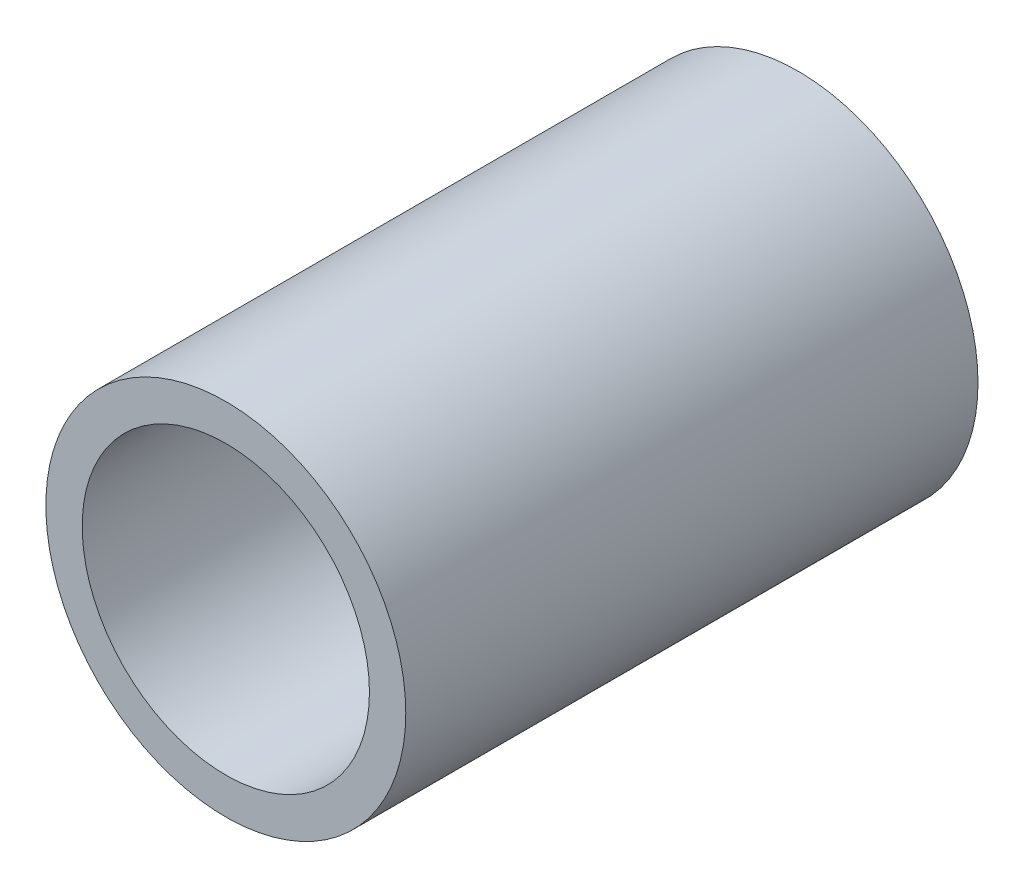
ISO-10303-21;
HEADER;
FILE_DESCRIPTION(('STEP AP214'),'2;1');
FILE_NAME('part.step','',(''),(''),'','','');
FILE_SCHEMA(('AUTOMOTIVE_DESIGN { 1 0 10303 214 1 1 1 1 }'));
ENDSEC;
DATA;
#1=APPLICATION_CONTEXT('core data for automotive mechanical design processes');
#2=APPLICATION_PROTOCOL_DEFINITION('international standard','automotive_design',2000,#1);
#3=PRODUCT_CONTEXT('',#1,'mechanical');
#4=PRODUCT('Part','Part','',(#3));
#5=PRODUCT_RELATED_PRODUCT_CATEGORY('part','',(#4));
#6=PRODUCT_DEFINITION_FORMATION('','',#4);
#7=PRODUCT_DEFINITION_CONTEXT('part definition',#1,'design');
#8=PRODUCT_DEFINITION('design','',#6,#7);
#9=PRODUCT_DEFINITION_SHAPE('','',#8);
#10=(LENGTH_UNIT() NAMED_UNIT(*) SI_UNIT(.MILLI.,.METRE.));
#11=(NAMED_UNIT(*) PLANE_ANGLE_UNIT() SI_UNIT($,.RADIAN.));
#12=(NAMED_UNIT(*) SI_UNIT($,.STERADIAN.) SOLID_ANGLE_UNIT());
#13=UNCERTAINTY_MEASURE_WITH_UNIT(LENGTH_MEASURE(1.E-05),#10,'distance_accuracy_value','');
#14=(GEOMETRIC_REPRESENTATION_CONTEXT(3) GLOBAL_UNCERTAINTY_ASSIGNED_CONTEXT((#13)) GLOBAL_UNIT_ASSIGNED_CONTEXT((#10,
#11,#12)) REPRESENTATION_CONTEXT('',''));
#15=CARTESIAN_POINT('',(0.,0.,0.));
#16=DIRECTION('',(0.,0.,1.));
#17=DIRECTION('',(1.,0.,0.));
#18=AXIS2_PLACEMENT_3D('',#15,#16,#17);
#19=CARTESIAN_POINT('',(0.,0.,6.35));
#20=DIRECTION('',(0.,0.,1.));
#21=DIRECTION('',(1.,0.,0.));
#22=AXIS2_PLACEMENT_3D('',#19,#20,#21);
#23=PLANE('',#22);
#24=CARTESIAN_POINT('',(0.,0.,6.35));
#25=DIRECTION('',(0.,0.,1.));
#26=DIRECTION('',(1.,0.,0.));
#27=AXIS2_PLACEMENT_3D('',#24,#25,#26);
#28=CIRCLE('',#27,3.99415);
#29=CARTESIAN_POINT('',(3.99415,0.,6.35));
#30=VERTEX_POINT('',#29);
#31=EDGE_CURVE('E10',#30,#30,#28,.T.);
#32=ORIENTED_EDGE('',*,*,#31,.T.);
#33=EDGE_LOOP('',(#32));
#34=FACE_BOUND('',#33,.T.);
#35=CARTESIAN_POINT('',(0.,0.,6.35));
#36=DIRECTION('',(0.,0.,1.));
#37=DIRECTION('',(1.,0.,0.));
#38=AXIS2_PLACEMENT_3D('',#35,#36,#37);
#39=CIRCLE('',#38,3.1877);
#40=CARTESIAN_POINT('',(3.1877,0.,6.35));
#41=VERTEX_POINT('',#40);
#42=EDGE_CURVE('E42',#41,#41,#39,.T.);
#43=ORIENTED_EDGE('',*,*,#42,.F.);
#44=EDGE_LOOP('',(#43));
#45=FACE_BOUND('',#44,.T.);
#46=ADVANCED_FACE('F35',(#34,#45),#23,.T.);
#47=CARTESIAN_POINT('',(0.,0.,6.35));
#48=DIRECTION('',(0.,0.,-1.));
#49=DIRECTION('',(-1.,0.,0.));
#50=AXIS2_PLACEMENT_3D('',#47,#48,#49);
#51=CYLINDRICAL_SURFACE('',#50,3.99415);
#52=ORIENTED_EDGE('',*,*,#31,.F.);
#53=EDGE_LOOP('',(#52));
#54=FACE_BOUND('',#53,.T.);
#55=CARTESIAN_POINT('',(0.,0.,-6.35));
#56=DIRECTION('',(0.,0.,1.));
#57=DIRECTION('',(1.,0.,0.));
#58=AXIS2_PLACEMENT_3D('',#55,#56,#57);
#59=CIRCLE('',#58,3.99415);
#60=CARTESIAN_POINT('',(3.99415,0.,-6.35));
#61=VERTEX_POINT('',#60);
#62=EDGE_CURVE('E46',#61,#61,#59,.T.);
#63=ORIENTED_EDGE('',*,*,#62,.T.);
#64=EDGE_LOOP('',(#63));
#65=FACE_BOUND('',#64,.T.);
#66=ADVANCED_FACE('F37',(#54,#65),#51,.T.);
#67=CARTESIAN_POINT('',(0.,0.,6.35));
#68=DIRECTION('',(0.,0.,-1.));
#69=DIRECTION('',(-1.,0.,0.));
#70=AXIS2_PLACEMENT_3D('',#67,#68,#69);
#71=CYLINDRICAL_SURFACE('',#70,3.1877);
#72=ORIENTED_EDGE('',*,*,#42,.T.);
#73=EDGE_LOOP('',(#72));
#74=FACE_BOUND('',#73,.T.);
#75=CARTESIAN_POINT('',(0.,0.,-6.35));
#76=DIRECTION('',(0.,0.,1.));
#77=DIRECTION('',(1.,0.,0.));
#78=AXIS2_PLACEMENT_3D('',#75,#76,#77);
#79=CIRCLE('',#78,3.1877);
#80=CARTESIAN_POINT('',(3.1877,0.,-6.35));
#81=VERTEX_POINT('',#80);
#82=EDGE_CURVE('E50',#81,#81,#79,.T.);
#83=ORIENTED_EDGE('',*,*,#82,.F.);
#84=EDGE_LOOP('',(#83));
#85=FACE_BOUND('',#84,.T.);
#86=ADVANCED_FACE('F59',(#74,#85),#71,.F.);
#87=CARTESIAN_POINT('',(0.,0.,-6.35));
#88=DIRECTION('',(0.,0.,1.));
#89=DIRECTION('',(1.,0.,0.));
#90=AXIS2_PLACEMENT_3D('',#87,#88,#89);
#91=PLANE('',#90);
#92=ORIENTED_EDGE('',*,*,#82,.T.);
#93=EDGE_LOOP('',(#92));
#94=FACE_BOUND('',#93,.T.);
#95=ORIENTED_EDGE('',*,*,#62,.F.);
#96=EDGE_LOOP('',(#95));
#97=FACE_BOUND('',#96,.T.);
#98=ADVANCED_FACE('F56',(#94,#97),#91,.F.);
#99=CLOSED_SHELL('',(#46,#66,#86,#98));
#100=MANIFOLD_SOLID_BREP('B2',#99);
#101=ADVANCED_BREP_SHAPE_REPRESENTATION('',(#18,#100),#14);
#102=SHAPE_DEFINITION_REPRESENTATION(#9,#101);
ENDSEC;
END-ISO-10303-21;
